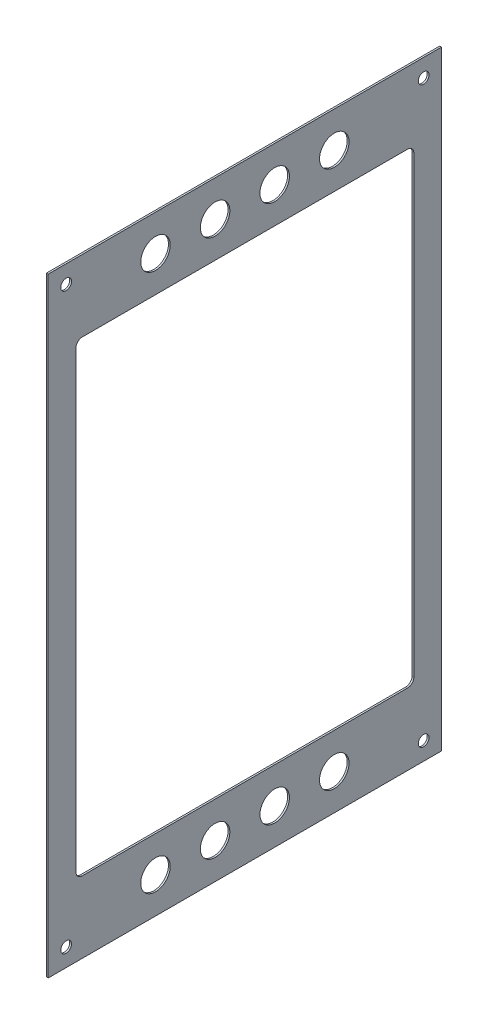
ISO-10303-21;
HEADER;
FILE_DESCRIPTION(('STEP AP214'),'2;1');
FILE_NAME('part.step','',(''),(''),'','','');
FILE_SCHEMA(('AUTOMOTIVE_DESIGN { 1 0 10303 214 1 1 1 1 }'));
ENDSEC;
DATA;
#1=APPLICATION_CONTEXT('core data for automotive mechanical design processes');
#2=APPLICATION_PROTOCOL_DEFINITION('international standard','automotive_design',2000,#1);
#3=PRODUCT_CONTEXT('',#1,'mechanical');
#4=PRODUCT('Part','Part','',(#3));
#5=PRODUCT_RELATED_PRODUCT_CATEGORY('part','',(#4));
#6=PRODUCT_DEFINITION_FORMATION('','',#4);
#7=PRODUCT_DEFINITION_CONTEXT('part definition',#1,'design');
#8=PRODUCT_DEFINITION('design','',#6,#7);
#9=PRODUCT_DEFINITION_SHAPE('','',#8);
#10=(LENGTH_UNIT() NAMED_UNIT(*) SI_UNIT(.MILLI.,.METRE.));
#11=(NAMED_UNIT(*) PLANE_ANGLE_UNIT() SI_UNIT($,.RADIAN.));
#12=(NAMED_UNIT(*) SI_UNIT($,.STERADIAN.) SOLID_ANGLE_UNIT());
#13=UNCERTAINTY_MEASURE_WITH_UNIT(LENGTH_MEASURE(1.E-05),#10,'distance_accuracy_value','');
#14=(GEOMETRIC_REPRESENTATION_CONTEXT(3) GLOBAL_UNCERTAINTY_ASSIGNED_CONTEXT((#13)) GLOBAL_UNIT_ASSIGNED_CONTEXT((#10,
#11,#12)) REPRESENTATION_CONTEXT('',''));
#15=CARTESIAN_POINT('',(0.,0.,0.));
#16=DIRECTION('',(0.,0.,1.));
#17=DIRECTION('',(1.,0.,0.));
#18=AXIS2_PLACEMENT_3D('',#15,#16,#17);
#19=CARTESIAN_POINT('',(1.,0.,0.));
#20=DIRECTION('',(-1.,0.,0.));
#21=DIRECTION('',(0.,0.,1.));
#22=AXIS2_PLACEMENT_3D('',#19,#20,#21);
#23=PLANE('',#22);
#24=CARTESIAN_POINT('',(1.,160.5,99.9999999999998));
#25=DIRECTION('',(1.,0.,0.));
#26=DIRECTION('',(0.,0.,1.));
#27=AXIS2_PLACEMENT_3D('',#24,#25,#26);
#28=CIRCLE('',#27,2.99999999999999);
#29=CARTESIAN_POINT('',(1.,160.5,103.));
#30=VERTEX_POINT('',#29);
#31=EDGE_CURVE('E491',#30,#30,#28,.T.);
#32=ORIENTED_EDGE('',*,*,#31,.F.);
#33=EDGE_LOOP('',(#32));
#34=FACE_BOUND('',#33,.T.);
#35=CARTESIAN_POINT('',(1.,-160.5,-100.));
#36=DIRECTION('',(1.,0.,0.));
#37=DIRECTION('',(0.,0.,1.));
#38=AXIS2_PLACEMENT_3D('',#35,#36,#37);
#39=CIRCLE('',#38,2.99999999999999);
#40=CARTESIAN_POINT('',(1.,-160.5,-97.));
#41=VERTEX_POINT('',#40);
#42=EDGE_CURVE('E497',#41,#41,#39,.T.);
#43=ORIENTED_EDGE('',*,*,#42,.F.);
#44=EDGE_LOOP('',(#43));
#45=FACE_BOUND('',#44,.T.);
#46=CARTESIAN_POINT('',(1.,160.5,-99.9999999999998));
#47=DIRECTION('',(1.,0.,0.));
#48=DIRECTION('',(0.,0.,-1.));
#49=AXIS2_PLACEMENT_3D('',#46,#47,#48);
#50=CIRCLE('',#49,2.99999999999999);
#51=CARTESIAN_POINT('',(1.,160.5,-103.));
#52=VERTEX_POINT('',#51);
#53=EDGE_CURVE('E510',#52,#52,#50,.T.);
#54=ORIENTED_EDGE('',*,*,#53,.F.);
#55=EDGE_LOOP('',(#54));
#56=FACE_BOUND('',#55,.T.);
#57=CARTESIAN_POINT('',(1.,-160.5,100.));
#58=DIRECTION('',(1.,0.,0.));
#59=DIRECTION('',(0.,0.,-1.));
#60=AXIS2_PLACEMENT_3D('',#57,#58,#59);
#61=CIRCLE('',#60,2.99999999999999);
#62=CARTESIAN_POINT('',(1.,-160.5,97.));
#63=VERTEX_POINT('',#62);
#64=EDGE_CURVE('E495',#63,#63,#61,.T.);
#65=ORIENTED_EDGE('',*,*,#64,.F.);
#66=EDGE_LOOP('',(#65));
#67=FACE_BOUND('',#66,.T.);
#68=DIRECTION('',(0.,0.,1.));
#69=VECTOR('',#68,1.);
#70=CARTESIAN_POINT('',(1.,170.5,-110.));
#71=LINE('',#70,#69);
#72=CARTESIAN_POINT('',(1.,170.5,-110.));
#73=VERTEX_POINT('',#72);
#74=CARTESIAN_POINT('',(1.,170.5,110.));
#75=VERTEX_POINT('',#74);
#76=EDGE_CURVE('E222',#73,#75,#71,.T.);
#77=ORIENTED_EDGE('',*,*,#76,.T.);
#78=DIRECTION('',(0.,-1.,0.));
#79=VECTOR('',#78,1.);
#80=CARTESIAN_POINT('',(1.,-170.5,110.));
#81=LINE('',#80,#79);
#82=CARTESIAN_POINT('',(1.,-170.5,110.));
#83=VERTEX_POINT('',#82);
#84=EDGE_CURVE('E221',#75,#83,#81,.T.);
#85=ORIENTED_EDGE('',*,*,#84,.T.);
#86=DIRECTION('',(0.,0.,-1.));
#87=VECTOR('',#86,1.);
#88=CARTESIAN_POINT('',(1.,-170.5,-110.));
#89=LINE('',#88,#87);
#90=CARTESIAN_POINT('',(1.,-170.5,-110.));
#91=VERTEX_POINT('',#90);
#92=EDGE_CURVE('E227',#83,#91,#89,.T.);
#93=ORIENTED_EDGE('',*,*,#92,.T.);
#94=DIRECTION('',(0.,1.,0.));
#95=VECTOR('',#94,1.);
#96=CARTESIAN_POINT('',(1.,-170.5,-110.));
#97=LINE('',#96,#95);
#98=EDGE_CURVE('E228',#91,#73,#97,.T.);
#99=ORIENTED_EDGE('',*,*,#98,.T.);
#100=EDGE_LOOP('',(#77,#85,#93,#99));
#101=FACE_BOUND('',#100,.T.);
#102=CARTESIAN_POINT('',(1.,150.502618019678,50.));
#103=DIRECTION('',(1.,0.,0.));
#104=DIRECTION('',(0.,0.,-1.));
#105=AXIS2_PLACEMENT_3D('',#102,#103,#104);
#106=CIRCLE('',#105,8.25);
#107=CARTESIAN_POINT('',(1.,150.502618019678,41.75));
#108=VERTEX_POINT('',#107);
#109=EDGE_CURVE('E194',#108,#108,#106,.T.);
#110=ORIENTED_EDGE('',*,*,#109,.F.);
#111=EDGE_LOOP('',(#110));
#112=FACE_BOUND('',#111,.T.);
#113=CARTESIAN_POINT('',(1.,-150.502618019678,-16.67));
#114=DIRECTION('',(1.,0.,0.));
#115=DIRECTION('',(0.,0.,-1.));
#116=AXIS2_PLACEMENT_3D('',#113,#114,#115);
#117=CIRCLE('',#116,8.25);
#118=CARTESIAN_POINT('',(1.,-150.502618019678,-24.92));
#119=VERTEX_POINT('',#118);
#120=EDGE_CURVE('E178',#119,#119,#117,.T.);
#121=ORIENTED_EDGE('',*,*,#120,.F.);
#122=EDGE_LOOP('',(#121));
#123=FACE_BOUND('',#122,.T.);
#124=CARTESIAN_POINT('',(1.,-150.502618019678,16.67));
#125=DIRECTION('',(1.,0.,0.));
#126=DIRECTION('',(0.,0.,1.));
#127=AXIS2_PLACEMENT_3D('',#124,#125,#126);
#128=CIRCLE('',#127,8.25);
#129=CARTESIAN_POINT('',(1.,-150.502618019678,24.92));
#130=VERTEX_POINT('',#129);
#131=EDGE_CURVE('E183',#130,#130,#128,.T.);
#132=ORIENTED_EDGE('',*,*,#131,.F.);
#133=EDGE_LOOP('',(#132));
#134=FACE_BOUND('',#133,.T.);
#135=CARTESIAN_POINT('',(1.,-150.502618019678,50.));
#136=DIRECTION('',(1.,0.,0.));
#137=DIRECTION('',(0.,0.,1.));
#138=AXIS2_PLACEMENT_3D('',#135,#136,#137);
#139=CIRCLE('',#138,8.25);
#140=CARTESIAN_POINT('',(1.,-150.502618019678,58.25));
#141=VERTEX_POINT('',#140);
#142=EDGE_CURVE('E155',#141,#141,#139,.T.);
#143=ORIENTED_EDGE('',*,*,#142,.F.);
#144=EDGE_LOOP('',(#143));
#145=FACE_BOUND('',#144,.T.);
#146=CARTESIAN_POINT('',(1.,-150.502618019678,-50.));
#147=DIRECTION('',(1.,0.,0.));
#148=DIRECTION('',(0.,0.,-1.));
#149=AXIS2_PLACEMENT_3D('',#146,#147,#148);
#150=CIRCLE('',#149,8.25);
#151=CARTESIAN_POINT('',(1.,-150.502618019678,-58.25));
#152=VERTEX_POINT('',#151);
#153=EDGE_CURVE('E209',#152,#152,#150,.T.);
#154=ORIENTED_EDGE('',*,*,#153,.F.);
#155=EDGE_LOOP('',(#154));
#156=FACE_BOUND('',#155,.T.);
#157=CARTESIAN_POINT('',(1.,150.502618019678,-50.));
#158=DIRECTION('',(1.,0.,0.));
#159=DIRECTION('',(0.,0.,1.));
#160=AXIS2_PLACEMENT_3D('',#157,#158,#159);
#161=CIRCLE('',#160,8.25);
#162=CARTESIAN_POINT('',(1.,150.502618019678,-41.75));
#163=VERTEX_POINT('',#162);
#164=EDGE_CURVE('E204',#163,#163,#161,.T.);
#165=ORIENTED_EDGE('',*,*,#164,.F.);
#166=EDGE_LOOP('',(#165));
#167=FACE_BOUND('',#166,.T.);
#168=CARTESIAN_POINT('',(1.,150.502618019678,16.67));
#169=DIRECTION('',(1.,0.,0.));
#170=DIRECTION('',(0.,0.,-1.));
#171=AXIS2_PLACEMENT_3D('',#168,#169,#170);
#172=CIRCLE('',#171,8.25);
#173=CARTESIAN_POINT('',(1.,150.502618019678,8.42));
#174=VERTEX_POINT('',#173);
#175=EDGE_CURVE('E196',#174,#174,#172,.T.);
#176=ORIENTED_EDGE('',*,*,#175,.F.);
#177=EDGE_LOOP('',(#176));
#178=FACE_BOUND('',#177,.T.);
#179=CARTESIAN_POINT('',(1.,150.502618019678,-16.67));
#180=DIRECTION('',(1.,0.,0.));
#181=DIRECTION('',(0.,0.,1.));
#182=AXIS2_PLACEMENT_3D('',#179,#180,#181);
#183=CIRCLE('',#182,8.25);
#184=CARTESIAN_POINT('',(1.,150.502618019678,-8.42));
#185=VERTEX_POINT('',#184);
#186=EDGE_CURVE('E192',#185,#185,#183,.T.);
#187=ORIENTED_EDGE('',*,*,#186,.F.);
#188=EDGE_LOOP('',(#187));
#189=FACE_BOUND('',#188,.T.);
#190=CARTESIAN_POINT('',(1.,-127.002676176067,91.0026761741868));
#191=DIRECTION('',(1.,0.,0.));
#192=DIRECTION('',(0.,0.,-1.));
#193=AXIS2_PLACEMENT_3D('',#190,#191,#192);
#194=CIRCLE('',#193,3.49994184365326);
#195=CARTESIAN_POINT('',(1.,-127.002659140498,94.5026180177986));
#196=VERTEX_POINT('',#195);
#197=CARTESIAN_POINT('',(1.,-130.502618019679,91.0026592423053));
#198=VERTEX_POINT('',#197);
#199=EDGE_CURVE('E53',#196,#198,#194,.T.);
#200=ORIENTED_EDGE('',*,*,#199,.F.);
#201=DIRECTION('',(0.,-1.,9.45281569404082E-12));
#202=VECTOR('',#201,1.);
#203=CARTESIAN_POINT('',(1.,127.002658987378,94.5026180153976));
#204=LINE('',#203,#202);
#205=CARTESIAN_POINT('',(1.,127.002658987378,94.5026180153976));
#206=VERTEX_POINT('',#205);
#207=EDGE_CURVE('E138',#206,#196,#204,.T.);
#208=ORIENTED_EDGE('',*,*,#207,.F.);
#209=CARTESIAN_POINT('',(1.,127.002676175909,91.0026761738117));
#210=DIRECTION('',(1.,0.,0.));
#211=DIRECTION('',(0.,0.,-1.));
#212=AXIS2_PLACEMENT_3D('',#209,#210,#211);
#213=CIRCLE('',#212,3.49994184162811);
#214=CARTESIAN_POINT('',(1.,130.502618017496,91.0026591410648));
#215=VERTEX_POINT('',#214);
#216=EDGE_CURVE('E141',#215,#206,#213,.T.);
#217=ORIENTED_EDGE('',*,*,#216,.F.);
#218=DIRECTION('',(0.,-1.19903632979093E-11,1.));
#219=VECTOR('',#218,1.);
#220=CARTESIAN_POINT('',(1.,130.502618019678,-91.0026591410729));
#221=LINE('',#220,#219);
#222=CARTESIAN_POINT('',(1.,130.502618019678,-91.0026591410729));
#223=VERTEX_POINT('',#222);
#224=EDGE_CURVE('E524',#223,#215,#221,.T.);
#225=ORIENTED_EDGE('',*,*,#224,.F.);
#226=CARTESIAN_POINT('',(1.,127.002676176064,-91.0026761741846));
#227=DIRECTION('',(1.,0.,0.));
#228=DIRECTION('',(0.,0.,-1.));
#229=AXIS2_PLACEMENT_3D('',#226,#227,#228);
#230=CIRCLE('',#229,3.49994184365533);
#231=CARTESIAN_POINT('',(1.,127.0026591409,-94.5026180177984));
#232=VERTEX_POINT('',#231);
#233=EDGE_CURVE('E527',#232,#223,#230,.T.);
#234=ORIENTED_EDGE('',*,*,#233,.F.);
#235=DIRECTION('',(0.,1.,-9.45565675645445E-12));
#236=VECTOR('',#235,1.);
#237=CARTESIAN_POINT('',(1.,-127.002658987379,-94.5026180153966));
#238=LINE('',#237,#236);
#239=CARTESIAN_POINT('',(1.,-127.002658987379,-94.5026180153966));
#240=VERTEX_POINT('',#239);
#241=EDGE_CURVE('E529',#240,#232,#238,.T.);
#242=ORIENTED_EDGE('',*,*,#241,.F.);
#243=CARTESIAN_POINT('',(1.,-127.002676175905,-91.0026761737985));
#244=DIRECTION('',(1.,0.,0.));
#245=DIRECTION('',(0.,0.,-1.));
#246=AXIS2_PLACEMENT_3D('',#243,#244,#245);
#247=CIRCLE('',#246,3.49994184164038);
#248=CARTESIAN_POINT('',(1.,-130.502618017504,-91.0026591410638));
#249=VERTEX_POINT('',#248);
#250=EDGE_CURVE('E152',#249,#240,#247,.T.);
#251=ORIENTED_EDGE('',*,*,#250,.F.);
#252=DIRECTION('',(0.,1.19508661262766E-11,-1.));
#253=VECTOR('',#252,1.);
#254=CARTESIAN_POINT('',(1.,-130.502618019679,91.0026592423053));
#255=LINE('',#254,#253);
#256=EDGE_CURVE('E146',#198,#249,#255,.T.);
#257=ORIENTED_EDGE('',*,*,#256,.F.);
#258=EDGE_LOOP('',(#200,#208,#217,#225,#234,#242,#251,#257));
#259=FACE_BOUND('',#258,.T.);
#260=ADVANCED_FACE('F39',(#34,#45,#56,#67,#101,#112,#123,#134,#145,#156,#167,#178,#189,#259),
#23,.F.);
#261=CARTESIAN_POINT('',(0.,0.,0.));
#262=DIRECTION('',(-1.,0.,0.));
#263=DIRECTION('',(0.,0.,1.));
#264=AXIS2_PLACEMENT_3D('',#261,#262,#263);
#265=PLANE('',#264);
#266=CARTESIAN_POINT('',(0.,160.5,99.9999999999998));
#267=DIRECTION('',(1.,0.,0.));
#268=DIRECTION('',(0.,0.,1.));
#269=AXIS2_PLACEMENT_3D('',#266,#267,#268);
#270=CIRCLE('',#269,2.99999999999999);
#271=CARTESIAN_POINT('',(0.,160.5,103.));
#272=VERTEX_POINT('',#271);
#273=EDGE_CURVE('E487',#272,#272,#270,.T.);
#274=ORIENTED_EDGE('',*,*,#273,.T.);
#275=EDGE_LOOP('',(#274));
#276=FACE_BOUND('',#275,.T.);
#277=CARTESIAN_POINT('',(0.,-160.5,-100.));
#278=DIRECTION('',(1.,0.,0.));
#279=DIRECTION('',(0.,0.,1.));
#280=AXIS2_PLACEMENT_3D('',#277,#278,#279);
#281=CIRCLE('',#280,2.99999999999999);
#282=CARTESIAN_POINT('',(0.,-160.5,-97.));
#283=VERTEX_POINT('',#282);
#284=EDGE_CURVE('E503',#283,#283,#281,.T.);
#285=ORIENTED_EDGE('',*,*,#284,.T.);
#286=EDGE_LOOP('',(#285));
#287=FACE_BOUND('',#286,.T.);
#288=CARTESIAN_POINT('',(0.,160.5,-99.9999999999998));
#289=DIRECTION('',(1.,0.,0.));
#290=DIRECTION('',(0.,0.,-1.));
#291=AXIS2_PLACEMENT_3D('',#288,#289,#290);
#292=CIRCLE('',#291,2.99999999999999);
#293=CARTESIAN_POINT('',(0.,160.5,-103.));
#294=VERTEX_POINT('',#293);
#295=EDGE_CURVE('E496',#294,#294,#292,.T.);
#296=ORIENTED_EDGE('',*,*,#295,.T.);
#297=EDGE_LOOP('',(#296));
#298=FACE_BOUND('',#297,.T.);
#299=CARTESIAN_POINT('',(0.,-160.5,100.));
#300=DIRECTION('',(1.,0.,0.));
#301=DIRECTION('',(0.,0.,-1.));
#302=AXIS2_PLACEMENT_3D('',#299,#300,#301);
#303=CIRCLE('',#302,2.99999999999999);
#304=CARTESIAN_POINT('',(0.,-160.5,97.));
#305=VERTEX_POINT('',#304);
#306=EDGE_CURVE('E135',#305,#305,#303,.T.);
#307=ORIENTED_EDGE('',*,*,#306,.T.);
#308=EDGE_LOOP('',(#307));
#309=FACE_BOUND('',#308,.T.);
#310=CARTESIAN_POINT('',(0.,150.502618019678,-16.67));
#311=DIRECTION('',(1.,0.,0.));
#312=DIRECTION('',(0.,0.,1.));
#313=AXIS2_PLACEMENT_3D('',#310,#311,#312);
#314=CIRCLE('',#313,8.25);
#315=CARTESIAN_POINT('',(0.,150.502618019678,-8.42));
#316=VERTEX_POINT('',#315);
#317=EDGE_CURVE('E191',#316,#316,#314,.T.);
#318=ORIENTED_EDGE('',*,*,#317,.T.);
#319=EDGE_LOOP('',(#318));
#320=FACE_BOUND('',#319,.T.);
#321=CARTESIAN_POINT('',(0.,150.502618019678,16.67));
#322=DIRECTION('',(1.,0.,0.));
#323=DIRECTION('',(0.,0.,-1.));
#324=AXIS2_PLACEMENT_3D('',#321,#322,#323);
#325=CIRCLE('',#324,8.25);
#326=CARTESIAN_POINT('',(0.,150.502618019678,8.42));
#327=VERTEX_POINT('',#326);
#328=EDGE_CURVE('E203',#327,#327,#325,.T.);
#329=ORIENTED_EDGE('',*,*,#328,.T.);
#330=EDGE_LOOP('',(#329));
#331=FACE_BOUND('',#330,.T.);
#332=CARTESIAN_POINT('',(0.,150.502618019678,-50.));
#333=DIRECTION('',(1.,0.,0.));
#334=DIRECTION('',(0.,0.,1.));
#335=AXIS2_PLACEMENT_3D('',#332,#333,#334);
#336=CIRCLE('',#335,8.25);
#337=CARTESIAN_POINT('',(0.,150.502618019678,-41.75));
#338=VERTEX_POINT('',#337);
#339=EDGE_CURVE('E210',#338,#338,#336,.T.);
#340=ORIENTED_EDGE('',*,*,#339,.T.);
#341=EDGE_LOOP('',(#340));
#342=FACE_BOUND('',#341,.T.);
#343=CARTESIAN_POINT('',(0.,-150.502618019678,-50.));
#344=DIRECTION('',(1.,0.,0.));
#345=DIRECTION('',(0.,0.,-1.));
#346=AXIS2_PLACEMENT_3D('',#343,#344,#345);
#347=CIRCLE('',#346,8.25);
#348=CARTESIAN_POINT('',(0.,-150.502618019678,-58.25));
#349=VERTEX_POINT('',#348);
#350=EDGE_CURVE('E182',#349,#349,#347,.T.);
#351=ORIENTED_EDGE('',*,*,#350,.T.);
#352=EDGE_LOOP('',(#351));
#353=FACE_BOUND('',#352,.T.);
#354=CARTESIAN_POINT('',(0.,-150.502618019678,50.));
#355=DIRECTION('',(1.,0.,0.));
#356=DIRECTION('',(0.,0.,1.));
#357=AXIS2_PLACEMENT_3D('',#354,#355,#356);
#358=CIRCLE('',#357,8.25);
#359=CARTESIAN_POINT('',(0.,-150.502618019678,58.25));
#360=VERTEX_POINT('',#359);
#361=EDGE_CURVE('E149',#360,#360,#358,.T.);
#362=ORIENTED_EDGE('',*,*,#361,.T.);
#363=EDGE_LOOP('',(#362));
#364=FACE_BOUND('',#363,.T.);
#365=CARTESIAN_POINT('',(0.,-150.502618019678,16.67));
#366=DIRECTION('',(1.,0.,0.));
#367=DIRECTION('',(0.,0.,1.));
#368=AXIS2_PLACEMENT_3D('',#365,#366,#367);
#369=CIRCLE('',#368,8.25);
#370=CARTESIAN_POINT('',(0.,-150.502618019678,24.92));
#371=VERTEX_POINT('',#370);
#372=EDGE_CURVE('E189',#371,#371,#369,.T.);
#373=ORIENTED_EDGE('',*,*,#372,.T.);
#374=EDGE_LOOP('',(#373));
#375=FACE_BOUND('',#374,.T.);
#376=CARTESIAN_POINT('',(0.,-150.502618019678,-16.67));
#377=DIRECTION('',(1.,0.,0.));
#378=DIRECTION('',(0.,0.,-1.));
#379=AXIS2_PLACEMENT_3D('',#376,#377,#378);
#380=CIRCLE('',#379,8.25);
#381=CARTESIAN_POINT('',(0.,-150.502618019678,-24.92));
#382=VERTEX_POINT('',#381);
#383=EDGE_CURVE('E185',#382,#382,#380,.T.);
#384=ORIENTED_EDGE('',*,*,#383,.T.);
#385=EDGE_LOOP('',(#384));
#386=FACE_BOUND('',#385,.T.);
#387=CARTESIAN_POINT('',(0.,150.502618019678,50.));
#388=DIRECTION('',(1.,0.,0.));
#389=DIRECTION('',(0.,0.,-1.));
#390=AXIS2_PLACEMENT_3D('',#387,#388,#389);
#391=CIRCLE('',#390,8.25);
#392=CARTESIAN_POINT('',(0.,150.502618019678,41.75));
#393=VERTEX_POINT('',#392);
#394=EDGE_CURVE('E214',#393,#393,#391,.T.);
#395=ORIENTED_EDGE('',*,*,#394,.T.);
#396=EDGE_LOOP('',(#395));
#397=FACE_BOUND('',#396,.T.);
#398=DIRECTION('',(0.,0.,1.));
#399=VECTOR('',#398,1.);
#400=CARTESIAN_POINT('',(0.,170.5,-110.));
#401=LINE('',#400,#399);
#402=CARTESIAN_POINT('',(0.,170.5,-110.));
#403=VERTEX_POINT('',#402);
#404=CARTESIAN_POINT('',(0.,170.5,110.));
#405=VERTEX_POINT('',#404);
#406=EDGE_CURVE('E217',#403,#405,#401,.T.);
#407=ORIENTED_EDGE('',*,*,#406,.F.);
#408=DIRECTION('',(0.,1.,0.));
#409=VECTOR('',#408,1.);
#410=CARTESIAN_POINT('',(0.,-170.5,-110.));
#411=LINE('',#410,#409);
#412=CARTESIAN_POINT('',(0.,-170.5,-110.));
#413=VERTEX_POINT('',#412);
#414=EDGE_CURVE('E223',#413,#403,#411,.T.);
#415=ORIENTED_EDGE('',*,*,#414,.F.);
#416=DIRECTION('',(0.,0.,-1.));
#417=VECTOR('',#416,1.);
#418=CARTESIAN_POINT('',(0.,-170.5,-110.));
#419=LINE('',#418,#417);
#420=CARTESIAN_POINT('',(0.,-170.5,110.));
#421=VERTEX_POINT('',#420);
#422=EDGE_CURVE('E237',#421,#413,#419,.T.);
#423=ORIENTED_EDGE('',*,*,#422,.F.);
#424=DIRECTION('',(0.,-1.,0.));
#425=VECTOR('',#424,1.);
#426=CARTESIAN_POINT('',(0.,-170.5,110.));
#427=LINE('',#426,#425);
#428=EDGE_CURVE('E234',#405,#421,#427,.T.);
#429=ORIENTED_EDGE('',*,*,#428,.F.);
#430=EDGE_LOOP('',(#407,#415,#423,#429));
#431=FACE_BOUND('',#430,.T.);
#432=DIRECTION('',(0.,-1.,9.45281569404082E-12));
#433=VECTOR('',#432,1.);
#434=CARTESIAN_POINT('',(0.,127.002658987378,94.5026180153976));
#435=LINE('',#434,#433);
#436=CARTESIAN_POINT('',(0.,127.002658987378,94.5026180153976));
#437=VERTEX_POINT('',#436);
#438=CARTESIAN_POINT('',(0.,-127.002659140498,94.5026180177986));
#439=VERTEX_POINT('',#438);
#440=EDGE_CURVE('E158',#437,#439,#435,.T.);
#441=ORIENTED_EDGE('',*,*,#440,.T.);
#442=CARTESIAN_POINT('',(0.,-127.002676176067,91.0026761741868));
#443=DIRECTION('',(1.,0.,0.));
#444=DIRECTION('',(0.,0.,-1.));
#445=AXIS2_PLACEMENT_3D('',#442,#443,#444);
#446=CIRCLE('',#445,3.49994184365326);
#447=CARTESIAN_POINT('',(0.,-130.502618019679,91.0026592423053));
#448=VERTEX_POINT('',#447);
#449=EDGE_CURVE('E128',#439,#448,#446,.T.);
#450=ORIENTED_EDGE('',*,*,#449,.T.);
#451=DIRECTION('',(0.,1.19508661262766E-11,-1.));
#452=VECTOR('',#451,1.);
#453=CARTESIAN_POINT('',(0.,-130.502618019679,91.0026592423053));
#454=LINE('',#453,#452);
#455=CARTESIAN_POINT('',(0.,-130.502618017504,-91.0026591410638));
#456=VERTEX_POINT('',#455);
#457=EDGE_CURVE('E173',#448,#456,#454,.T.);
#458=ORIENTED_EDGE('',*,*,#457,.T.);
#459=CARTESIAN_POINT('',(0.,-127.002676175905,-91.0026761737985));
#460=DIRECTION('',(1.,0.,0.));
#461=DIRECTION('',(0.,0.,-1.));
#462=AXIS2_PLACEMENT_3D('',#459,#460,#461);
#463=CIRCLE('',#462,3.49994184164038);
#464=CARTESIAN_POINT('',(0.,-127.002658987379,-94.5026180153966));
#465=VERTEX_POINT('',#464);
#466=EDGE_CURVE('E62',#456,#465,#463,.T.);
#467=ORIENTED_EDGE('',*,*,#466,.T.);
#468=DIRECTION('',(0.,1.,-9.45565675645445E-12));
#469=VECTOR('',#468,1.);
#470=CARTESIAN_POINT('',(0.,-127.002658987379,-94.5026180153966));
#471=LINE('',#470,#469);
#472=CARTESIAN_POINT('',(0.,127.0026591409,-94.5026180177984));
#473=VERTEX_POINT('',#472);
#474=EDGE_CURVE('E168',#465,#473,#471,.T.);
#475=ORIENTED_EDGE('',*,*,#474,.T.);
#476=CARTESIAN_POINT('',(0.,127.002676176064,-91.0026761741846));
#477=DIRECTION('',(1.,0.,0.));
#478=DIRECTION('',(0.,0.,-1.));
#479=AXIS2_PLACEMENT_3D('',#476,#477,#478);
#480=CIRCLE('',#479,3.49994184365533);
#481=CARTESIAN_POINT('',(0.,130.502618019678,-91.0026591410729));
#482=VERTEX_POINT('',#481);
#483=EDGE_CURVE('E170',#473,#482,#480,.T.);
#484=ORIENTED_EDGE('',*,*,#483,.T.);
#485=DIRECTION('',(0.,-1.19903632979093E-11,1.));
#486=VECTOR('',#485,1.);
#487=CARTESIAN_POINT('',(0.,130.502618019678,-91.0026591410729));
#488=LINE('',#487,#486);
#489=CARTESIAN_POINT('',(0.,130.502618017496,91.0026591410648));
#490=VERTEX_POINT('',#489);
#491=EDGE_CURVE('E163',#482,#490,#488,.T.);
#492=ORIENTED_EDGE('',*,*,#491,.T.);
#493=CARTESIAN_POINT('',(0.,127.002676175909,91.0026761738117));
#494=DIRECTION('',(1.,0.,0.));
#495=DIRECTION('',(0.,0.,-1.));
#496=AXIS2_PLACEMENT_3D('',#493,#494,#495);
#497=CIRCLE('',#496,3.49994184162811);
#498=EDGE_CURVE('E159',#490,#437,#497,.T.);
#499=ORIENTED_EDGE('',*,*,#498,.T.);
#500=EDGE_LOOP('',(#441,#450,#458,#467,#475,#484,#492,#499));
#501=FACE_BOUND('',#500,.T.);
#502=ADVANCED_FACE('F255',(#276,#287,#298,#309,#320,#331,#342,#353,#364,#375,#386,#397,#431,
#501),#265,.T.);
#503=CARTESIAN_POINT('',(1.,170.5,-110.));
#504=DIRECTION('',(0.,-1.,0.));
#505=DIRECTION('',(0.,0.,-1.));
#506=AXIS2_PLACEMENT_3D('',#503,#504,#505);
#507=PLANE('',#506);
#508=ORIENTED_EDGE('',*,*,#406,.T.);
#509=DIRECTION('',(-1.,0.,0.));
#510=VECTOR('',#509,1.);
#511=CARTESIAN_POINT('',(1.,170.5,110.));
#512=LINE('',#511,#510);
#513=EDGE_CURVE('E11',#75,#405,#512,.T.);
#514=ORIENTED_EDGE('',*,*,#513,.F.);
#515=ORIENTED_EDGE('',*,*,#76,.F.);
#516=DIRECTION('',(-1.,0.,0.));
#517=VECTOR('',#516,1.);
#518=CARTESIAN_POINT('',(1.,170.5,-110.));
#519=LINE('',#518,#517);
#520=EDGE_CURVE('E232',#73,#403,#519,.T.);
#521=ORIENTED_EDGE('',*,*,#520,.T.);
#522=EDGE_LOOP('',(#508,#514,#515,#521));
#523=FACE_BOUND('',#522,.T.);
#524=ADVANCED_FACE('F41',(#523),#507,.F.);
#525=CARTESIAN_POINT('',(1.,-170.5,110.));
#526=DIRECTION('',(0.,0.,-1.));
#527=DIRECTION('',(-1.,0.,0.));
#528=AXIS2_PLACEMENT_3D('',#525,#526,#527);
#529=PLANE('',#528);
#530=ORIENTED_EDGE('',*,*,#428,.T.);
#531=DIRECTION('',(-1.,0.,0.));
#532=VECTOR('',#531,1.);
#533=CARTESIAN_POINT('',(1.,-170.5,110.));
#534=LINE('',#533,#532);
#535=EDGE_CURVE('E50',#83,#421,#534,.T.);
#536=ORIENTED_EDGE('',*,*,#535,.F.);
#537=ORIENTED_EDGE('',*,*,#84,.F.);
#538=ORIENTED_EDGE('',*,*,#513,.T.);
#539=EDGE_LOOP('',(#530,#536,#537,#538));
#540=FACE_BOUND('',#539,.T.);
#541=ADVANCED_FACE('F264',(#540),#529,.F.);
#542=CARTESIAN_POINT('',(1.,-170.5,-110.));
#543=DIRECTION('',(0.,1.,0.));
#544=DIRECTION('',(0.,0.,1.));
#545=AXIS2_PLACEMENT_3D('',#542,#543,#544);
#546=PLANE('',#545);
#547=ORIENTED_EDGE('',*,*,#422,.T.);
#548=DIRECTION('',(-1.,0.,0.));
#549=VECTOR('',#548,1.);
#550=CARTESIAN_POINT('',(1.,-170.5,-110.));
#551=LINE('',#550,#549);
#552=EDGE_CURVE('E241',#91,#413,#551,.T.);
#553=ORIENTED_EDGE('',*,*,#552,.F.);
#554=ORIENTED_EDGE('',*,*,#92,.F.);
#555=ORIENTED_EDGE('',*,*,#535,.T.);
#556=EDGE_LOOP('',(#547,#553,#554,#555));
#557=FACE_BOUND('',#556,.T.);
#558=ADVANCED_FACE('F248',(#557),#546,.F.);
#559=CARTESIAN_POINT('',(1.,-170.5,-110.));
#560=DIRECTION('',(0.,0.,1.));
#561=DIRECTION('',(1.,0.,0.));
#562=AXIS2_PLACEMENT_3D('',#559,#560,#561);
#563=PLANE('',#562);
#564=ORIENTED_EDGE('',*,*,#414,.T.);
#565=ORIENTED_EDGE('',*,*,#520,.F.);
#566=ORIENTED_EDGE('',*,*,#98,.F.);
#567=ORIENTED_EDGE('',*,*,#552,.T.);
#568=EDGE_LOOP('',(#564,#565,#566,#567));
#569=FACE_BOUND('',#568,.T.);
#570=ADVANCED_FACE('F256',(#569),#563,.F.);
#571=CARTESIAN_POINT('',(0.,150.502618019678,50.));
#572=DIRECTION('',(1.,0.,0.));
#573=DIRECTION('',(0.,0.,-1.));
#574=AXIS2_PLACEMENT_3D('',#571,#572,#573);
#575=CYLINDRICAL_SURFACE('',#574,8.25);
#576=ORIENTED_EDGE('',*,*,#394,.F.);
#577=EDGE_LOOP('',(#576));
#578=FACE_BOUND('',#577,.T.);
#579=ORIENTED_EDGE('',*,*,#109,.T.);
#580=EDGE_LOOP('',(#579));
#581=FACE_BOUND('',#580,.T.);
#582=ADVANCED_FACE('F283',(#578,#581),#575,.F.);
#583=CARTESIAN_POINT('',(0.,-150.502618019678,-16.67));
#584=DIRECTION('',(1.,0.,0.));
#585=DIRECTION('',(0.,0.,-1.));
#586=AXIS2_PLACEMENT_3D('',#583,#584,#585);
#587=CYLINDRICAL_SURFACE('',#586,8.25);
#588=ORIENTED_EDGE('',*,*,#383,.F.);
#589=EDGE_LOOP('',(#588));
#590=FACE_BOUND('',#589,.T.);
#591=ORIENTED_EDGE('',*,*,#120,.T.);
#592=EDGE_LOOP('',(#591));
#593=FACE_BOUND('',#592,.T.);
#594=ADVANCED_FACE('F292',(#590,#593),#587,.F.);
#595=CARTESIAN_POINT('',(0.,-150.502618019678,16.67));
#596=DIRECTION('',(1.,0.,0.));
#597=DIRECTION('',(0.,0.,-1.));
#598=AXIS2_PLACEMENT_3D('',#595,#596,#597);
#599=CYLINDRICAL_SURFACE('',#598,8.25);
#600=ORIENTED_EDGE('',*,*,#372,.F.);
#601=EDGE_LOOP('',(#600));
#602=FACE_BOUND('',#601,.T.);
#603=ORIENTED_EDGE('',*,*,#131,.T.);
#604=EDGE_LOOP('',(#603));
#605=FACE_BOUND('',#604,.T.);
#606=ADVANCED_FACE('F296',(#602,#605),#599,.F.);
#607=CARTESIAN_POINT('',(0.,-150.502618019678,50.));
#608=DIRECTION('',(1.,0.,0.));
#609=DIRECTION('',(0.,0.,-1.));
#610=AXIS2_PLACEMENT_3D('',#607,#608,#609);
#611=CYLINDRICAL_SURFACE('',#610,8.25);
#612=ORIENTED_EDGE('',*,*,#361,.F.);
#613=EDGE_LOOP('',(#612));
#614=FACE_BOUND('',#613,.T.);
#615=ORIENTED_EDGE('',*,*,#142,.T.);
#616=EDGE_LOOP('',(#615));
#617=FACE_BOUND('',#616,.T.);
#618=ADVANCED_FACE('F362',(#614,#617),#611,.F.);
#619=CARTESIAN_POINT('',(0.,-127.002676176067,91.0026761741868));
#620=DIRECTION('',(1.,0.,0.));
#621=DIRECTION('',(0.,0.,-1.));
#622=AXIS2_PLACEMENT_3D('',#619,#620,#621);
#623=CYLINDRICAL_SURFACE('',#622,3.49994184365326);
#624=ORIENTED_EDGE('',*,*,#199,.T.);
#625=DIRECTION('',(1.,0.,0.));
#626=VECTOR('',#625,1.);
#627=CARTESIAN_POINT('',(0.,-130.502618019679,91.0026592423053));
#628=LINE('',#627,#626);
#629=EDGE_CURVE('E161',#448,#198,#628,.T.);
#630=ORIENTED_EDGE('',*,*,#629,.F.);
#631=ORIENTED_EDGE('',*,*,#449,.F.);
#632=DIRECTION('',(1.,0.,0.));
#633=VECTOR('',#632,1.);
#634=CARTESIAN_POINT('',(0.,-127.002659140498,94.5026180177986));
#635=LINE('',#634,#633);
#636=EDGE_CURVE('E127',#439,#196,#635,.T.);
#637=ORIENTED_EDGE('',*,*,#636,.T.);
#638=EDGE_LOOP('',(#624,#630,#631,#637));
#639=FACE_BOUND('',#638,.T.);
#640=ADVANCED_FACE('F126',(#639),#623,.F.);
#641=CARTESIAN_POINT('',(0.,127.002658987378,94.5026180153976));
#642=DIRECTION('',(0.,9.45281569404082E-12,1.));
#643=DIRECTION('',(0.,-1.,9.45281569404082E-12));
#644=AXIS2_PLACEMENT_3D('',#641,#642,#643);
#645=PLANE('',#644);
#646=ORIENTED_EDGE('',*,*,#207,.T.);
#647=ORIENTED_EDGE('',*,*,#636,.F.);
#648=ORIENTED_EDGE('',*,*,#440,.F.);
#649=DIRECTION('',(1.,0.,0.));
#650=VECTOR('',#649,1.);
#651=CARTESIAN_POINT('',(0.,127.002658987378,94.5026180153976));
#652=LINE('',#651,#650);
#653=EDGE_CURVE('E133',#437,#206,#652,.T.);
#654=ORIENTED_EDGE('',*,*,#653,.T.);
#655=EDGE_LOOP('',(#646,#647,#648,#654));
#656=FACE_BOUND('',#655,.T.);
#657=ADVANCED_FACE('F139',(#656),#645,.F.);
#658=CARTESIAN_POINT('',(0.,127.002676175909,91.0026761738117));
#659=DIRECTION('',(1.,0.,0.));
#660=DIRECTION('',(0.,0.,-1.));
#661=AXIS2_PLACEMENT_3D('',#658,#659,#660);
#662=CYLINDRICAL_SURFACE('',#661,3.49994184162811);
#663=ORIENTED_EDGE('',*,*,#216,.T.);
#664=ORIENTED_EDGE('',*,*,#653,.F.);
#665=ORIENTED_EDGE('',*,*,#498,.F.);
#666=DIRECTION('',(1.,0.,0.));
#667=VECTOR('',#666,1.);
#668=CARTESIAN_POINT('',(0.,130.502618017496,91.0026591410648));
#669=LINE('',#668,#667);
#670=EDGE_CURVE('E520',#490,#215,#669,.T.);
#671=ORIENTED_EDGE('',*,*,#670,.T.);
#672=EDGE_LOOP('',(#663,#664,#665,#671));
#673=FACE_BOUND('',#672,.T.);
#674=ADVANCED_FACE('F389',(#673),#662,.F.);
#675=CARTESIAN_POINT('',(0.,130.502618019678,-91.0026591410729));
#676=DIRECTION('',(0.,1.,1.19903632979093E-11));
#677=DIRECTION('',(0.,-1.19903632979093E-11,1.));
#678=AXIS2_PLACEMENT_3D('',#675,#676,#677);
#679=PLANE('',#678);
#680=ORIENTED_EDGE('',*,*,#224,.T.);
#681=ORIENTED_EDGE('',*,*,#670,.F.);
#682=ORIENTED_EDGE('',*,*,#491,.F.);
#683=DIRECTION('',(1.,0.,0.));
#684=VECTOR('',#683,1.);
#685=CARTESIAN_POINT('',(0.,130.502618019678,-91.0026591410729));
#686=LINE('',#685,#684);
#687=EDGE_CURVE('E519',#482,#223,#686,.T.);
#688=ORIENTED_EDGE('',*,*,#687,.T.);
#689=EDGE_LOOP('',(#680,#681,#682,#688));
#690=FACE_BOUND('',#689,.T.);
#691=ADVANCED_FACE('F383',(#690),#679,.F.);
#692=CARTESIAN_POINT('',(0.,127.002676176064,-91.0026761741846));
#693=DIRECTION('',(1.,0.,0.));
#694=DIRECTION('',(0.,0.,-1.));
#695=AXIS2_PLACEMENT_3D('',#692,#693,#694);
#696=CYLINDRICAL_SURFACE('',#695,3.49994184365533);
#697=ORIENTED_EDGE('',*,*,#233,.T.);
#698=ORIENTED_EDGE('',*,*,#687,.F.);
#699=ORIENTED_EDGE('',*,*,#483,.F.);
#700=DIRECTION('',(1.,0.,0.));
#701=VECTOR('',#700,1.);
#702=CARTESIAN_POINT('',(0.,127.0026591409,-94.5026180177984));
#703=LINE('',#702,#701);
#704=EDGE_CURVE('E516',#473,#232,#703,.T.);
#705=ORIENTED_EDGE('',*,*,#704,.T.);
#706=EDGE_LOOP('',(#697,#698,#699,#705));
#707=FACE_BOUND('',#706,.T.);
#708=ADVANCED_FACE('F379',(#707),#696,.F.);
#709=CARTESIAN_POINT('',(0.,-127.002658987379,-94.5026180153966));
#710=DIRECTION('',(0.,-9.45565675645445E-12,-1.));
#711=DIRECTION('',(0.,1.,-9.45565675645445E-12));
#712=AXIS2_PLACEMENT_3D('',#709,#710,#711);
#713=PLANE('',#712);
#714=ORIENTED_EDGE('',*,*,#241,.T.);
#715=ORIENTED_EDGE('',*,*,#704,.F.);
#716=ORIENTED_EDGE('',*,*,#474,.F.);
#717=DIRECTION('',(1.,0.,0.));
#718=VECTOR('',#717,1.);
#719=CARTESIAN_POINT('',(0.,-127.002658987379,-94.5026180153966));
#720=LINE('',#719,#718);
#721=EDGE_CURVE('E514',#465,#240,#720,.T.);
#722=ORIENTED_EDGE('',*,*,#721,.T.);
#723=EDGE_LOOP('',(#714,#715,#716,#722));
#724=FACE_BOUND('',#723,.T.);
#725=ADVANCED_FACE('F380',(#724),#713,.F.);
#726=CARTESIAN_POINT('',(0.,-127.002676175905,-91.0026761737985));
#727=DIRECTION('',(1.,0.,0.));
#728=DIRECTION('',(0.,0.,-1.));
#729=AXIS2_PLACEMENT_3D('',#726,#727,#728);
#730=CYLINDRICAL_SURFACE('',#729,3.49994184164038);
#731=ORIENTED_EDGE('',*,*,#250,.T.);
#732=ORIENTED_EDGE('',*,*,#721,.F.);
#733=ORIENTED_EDGE('',*,*,#466,.F.);
#734=DIRECTION('',(1.,0.,0.));
#735=VECTOR('',#734,1.);
#736=CARTESIAN_POINT('',(0.,-130.502618017504,-91.0026591410638));
#737=LINE('',#736,#735);
#738=EDGE_CURVE('E515',#456,#249,#737,.T.);
#739=ORIENTED_EDGE('',*,*,#738,.T.);
#740=EDGE_LOOP('',(#731,#732,#733,#739));
#741=FACE_BOUND('',#740,.T.);
#742=ADVANCED_FACE('F341',(#741),#730,.F.);
#743=CARTESIAN_POINT('',(0.,-130.502618019679,91.0026592423053));
#744=DIRECTION('',(0.,-1.,-1.19508661262766E-11));
#745=DIRECTION('',(0.,1.19508661262766E-11,-1.));
#746=AXIS2_PLACEMENT_3D('',#743,#744,#745);
#747=PLANE('',#746);
#748=ORIENTED_EDGE('',*,*,#256,.T.);
#749=ORIENTED_EDGE('',*,*,#738,.F.);
#750=ORIENTED_EDGE('',*,*,#457,.F.);
#751=ORIENTED_EDGE('',*,*,#629,.T.);
#752=EDGE_LOOP('',(#748,#749,#750,#751));
#753=FACE_BOUND('',#752,.T.);
#754=ADVANCED_FACE('F340',(#753),#747,.F.);
#755=CARTESIAN_POINT('',(0.,-150.502618019678,-50.));
#756=DIRECTION('',(1.,0.,0.));
#757=DIRECTION('',(0.,0.,-1.));
#758=AXIS2_PLACEMENT_3D('',#755,#756,#757);
#759=CYLINDRICAL_SURFACE('',#758,8.25);
#760=ORIENTED_EDGE('',*,*,#350,.F.);
#761=EDGE_LOOP('',(#760));
#762=FACE_BOUND('',#761,.T.);
#763=ORIENTED_EDGE('',*,*,#153,.T.);
#764=EDGE_LOOP('',(#763));
#765=FACE_BOUND('',#764,.T.);
#766=ADVANCED_FACE('F337',(#762,#765),#759,.F.);
#767=CARTESIAN_POINT('',(0.,150.502618019678,-50.));
#768=DIRECTION('',(1.,0.,0.));
#769=DIRECTION('',(0.,0.,-1.));
#770=AXIS2_PLACEMENT_3D('',#767,#768,#769);
#771=CYLINDRICAL_SURFACE('',#770,8.25);
#772=ORIENTED_EDGE('',*,*,#339,.F.);
#773=EDGE_LOOP('',(#772));
#774=FACE_BOUND('',#773,.T.);
#775=ORIENTED_EDGE('',*,*,#164,.T.);
#776=EDGE_LOOP('',(#775));
#777=FACE_BOUND('',#776,.T.);
#778=ADVANCED_FACE('F329',(#774,#777),#771,.F.);
#779=CARTESIAN_POINT('',(0.,150.502618019678,16.67));
#780=DIRECTION('',(1.,0.,0.));
#781=DIRECTION('',(0.,0.,-1.));
#782=AXIS2_PLACEMENT_3D('',#779,#780,#781);
#783=CYLINDRICAL_SURFACE('',#782,8.25);
#784=ORIENTED_EDGE('',*,*,#328,.F.);
#785=EDGE_LOOP('',(#784));
#786=FACE_BOUND('',#785,.T.);
#787=ORIENTED_EDGE('',*,*,#175,.T.);
#788=EDGE_LOOP('',(#787));
#789=FACE_BOUND('',#788,.T.);
#790=ADVANCED_FACE('F319',(#786,#789),#783,.F.);
#791=CARTESIAN_POINT('',(0.,150.502618019678,-16.67));
#792=DIRECTION('',(1.,0.,0.));
#793=DIRECTION('',(0.,0.,-1.));
#794=AXIS2_PLACEMENT_3D('',#791,#792,#793);
#795=CYLINDRICAL_SURFACE('',#794,8.25);
#796=ORIENTED_EDGE('',*,*,#317,.F.);
#797=EDGE_LOOP('',(#796));
#798=FACE_BOUND('',#797,.T.);
#799=ORIENTED_EDGE('',*,*,#186,.T.);
#800=EDGE_LOOP('',(#799));
#801=FACE_BOUND('',#800,.T.);
#802=ADVANCED_FACE('F318',(#798,#801),#795,.F.);
#803=CARTESIAN_POINT('',(0.,-160.5,100.));
#804=DIRECTION('',(1.,0.,0.));
#805=DIRECTION('',(0.,0.,-1.));
#806=AXIS2_PLACEMENT_3D('',#803,#804,#805);
#807=CYLINDRICAL_SURFACE('',#806,2.99999999999999);
#808=ORIENTED_EDGE('',*,*,#306,.F.);
#809=EDGE_LOOP('',(#808));
#810=FACE_BOUND('',#809,.T.);
#811=ORIENTED_EDGE('',*,*,#64,.T.);
#812=EDGE_LOOP('',(#811));
#813=FACE_BOUND('',#812,.T.);
#814=ADVANCED_FACE('F317',(#810,#813),#807,.F.);
#815=CARTESIAN_POINT('',(0.,160.5,-99.9999999999998));
#816=DIRECTION('',(1.,0.,0.));
#817=DIRECTION('',(0.,0.,-1.));
#818=AXIS2_PLACEMENT_3D('',#815,#816,#817);
#819=CYLINDRICAL_SURFACE('',#818,2.99999999999999);
#820=ORIENTED_EDGE('',*,*,#295,.F.);
#821=EDGE_LOOP('',(#820));
#822=FACE_BOUND('',#821,.T.);
#823=ORIENTED_EDGE('',*,*,#53,.T.);
#824=EDGE_LOOP('',(#823));
#825=FACE_BOUND('',#824,.T.);
#826=ADVANCED_FACE('F330',(#822,#825),#819,.F.);
#827=CARTESIAN_POINT('',(0.,-160.5,-100.));
#828=DIRECTION('',(1.,0.,0.));
#829=DIRECTION('',(0.,0.,-1.));
#830=AXIS2_PLACEMENT_3D('',#827,#828,#829);
#831=CYLINDRICAL_SURFACE('',#830,2.99999999999999);
#832=ORIENTED_EDGE('',*,*,#284,.F.);
#833=EDGE_LOOP('',(#832));
#834=FACE_BOUND('',#833,.T.);
#835=ORIENTED_EDGE('',*,*,#42,.T.);
#836=EDGE_LOOP('',(#835));
#837=FACE_BOUND('',#836,.T.);
#838=ADVANCED_FACE('F463',(#834,#837),#831,.F.);
#839=CARTESIAN_POINT('',(0.,160.5,99.9999999999998));
#840=DIRECTION('',(1.,0.,0.));
#841=DIRECTION('',(0.,0.,-1.));
#842=AXIS2_PLACEMENT_3D('',#839,#840,#841);
#843=CYLINDRICAL_SURFACE('',#842,2.99999999999999);
#844=ORIENTED_EDGE('',*,*,#273,.F.);
#845=EDGE_LOOP('',(#844));
#846=FACE_BOUND('',#845,.T.);
#847=ORIENTED_EDGE('',*,*,#31,.T.);
#848=EDGE_LOOP('',(#847));
#849=FACE_BOUND('',#848,.T.);
#850=ADVANCED_FACE('F475',(#846,#849),#843,.F.);
#851=CLOSED_SHELL('',(#260,#502,#524,#541,#558,#570,#582,#594,#606,#618,#640,#657,#674,#691,
#708,#725,#742,#754,#766,#778,#790,#802,#814,#826,#838,#850));
#852=MANIFOLD_SOLID_BREP('B2',#851);
#853=ADVANCED_BREP_SHAPE_REPRESENTATION('',(#18,#852),#14);
#854=SHAPE_DEFINITION_REPRESENTATION(#9,#853);
ENDSEC;
END-ISO-10303-21;
